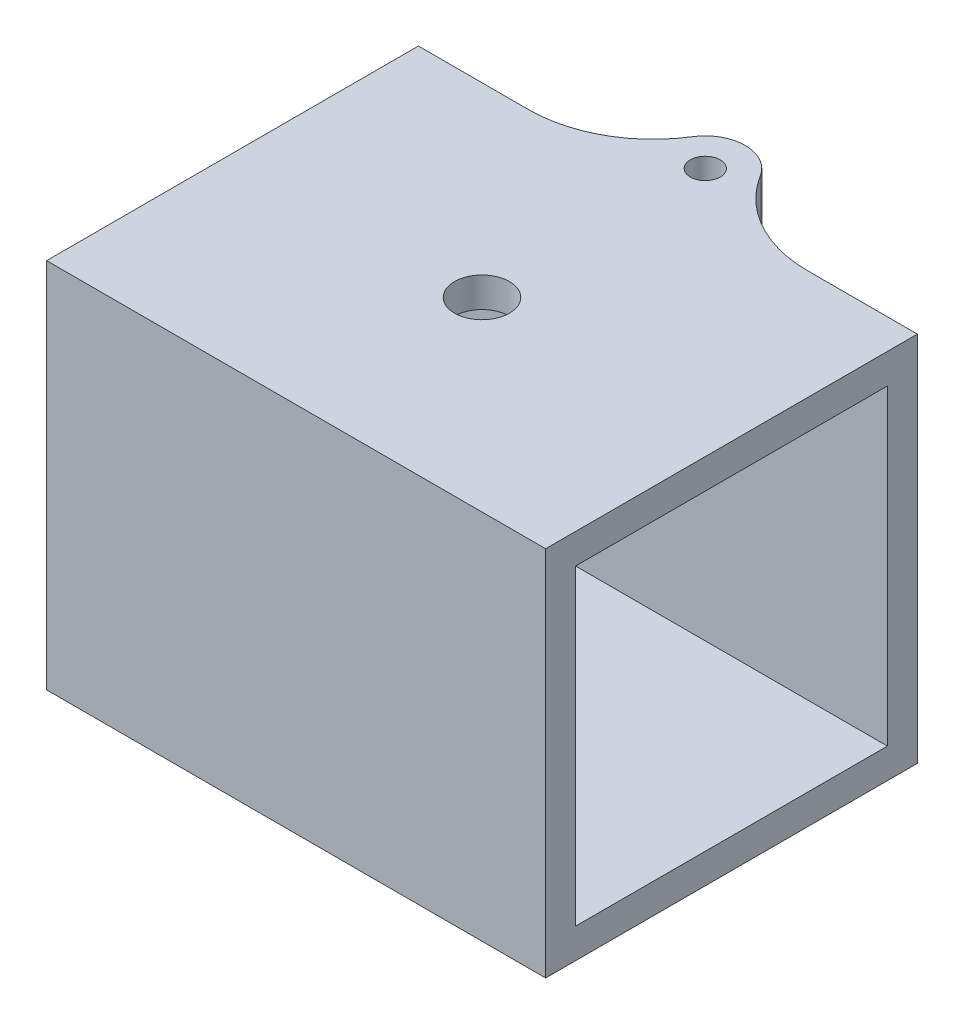
ISO-10303-21;
HEADER;
FILE_DESCRIPTION(('STEP AP214'),'2;1');
FILE_NAME('part.step','',(''),(''),'','','');
FILE_SCHEMA(('AUTOMOTIVE_DESIGN { 1 0 10303 214 1 1 1 1 }'));
ENDSEC;
DATA;
#1=APPLICATION_CONTEXT('core data for automotive mechanical design processes');
#2=APPLICATION_PROTOCOL_DEFINITION('international standard','automotive_design',2000,#1);
#3=PRODUCT_CONTEXT('',#1,'mechanical');
#4=PRODUCT('Part','Part','',(#3));
#5=PRODUCT_RELATED_PRODUCT_CATEGORY('part','',(#4));
#6=PRODUCT_DEFINITION_FORMATION('','',#4);
#7=PRODUCT_DEFINITION_CONTEXT('part definition',#1,'design');
#8=PRODUCT_DEFINITION('design','',#6,#7);
#9=PRODUCT_DEFINITION_SHAPE('','',#8);
#10=(LENGTH_UNIT() NAMED_UNIT(*) SI_UNIT(.MILLI.,.METRE.));
#11=(NAMED_UNIT(*) PLANE_ANGLE_UNIT() SI_UNIT($,.RADIAN.));
#12=(NAMED_UNIT(*) SI_UNIT($,.STERADIAN.) SOLID_ANGLE_UNIT());
#13=UNCERTAINTY_MEASURE_WITH_UNIT(LENGTH_MEASURE(1.E-05),#10,'distance_accuracy_value','');
#14=(GEOMETRIC_REPRESENTATION_CONTEXT(3) GLOBAL_UNCERTAINTY_ASSIGNED_CONTEXT((#13)) GLOBAL_UNIT_ASSIGNED_CONTEXT((#10,
#11,#12)) REPRESENTATION_CONTEXT('',''));
#15=CARTESIAN_POINT('',(0.,0.,0.));
#16=DIRECTION('',(0.,0.,1.));
#17=DIRECTION('',(1.,0.,0.));
#18=AXIS2_PLACEMENT_3D('',#15,#16,#17);
#19=CARTESIAN_POINT('',(40.,0.,0.));
#20=DIRECTION('',(1.,0.,0.));
#21=DIRECTION('',(0.,0.,-1.));
#22=AXIS2_PLACEMENT_3D('',#19,#20,#21);
#23=PLANE('',#22);
#24=DIRECTION('',(0.,1.,0.));
#25=VECTOR('',#24,1.);
#26=CARTESIAN_POINT('',(40.,0.,-14.9));
#27=LINE('',#26,#25);
#28=CARTESIAN_POINT('',(40.,-14.9,-14.9));
#29=VERTEX_POINT('',#28);
#30=CARTESIAN_POINT('',(40.,14.9,-14.9));
#31=VERTEX_POINT('',#30);
#32=EDGE_CURVE('E214',#29,#31,#27,.T.);
#33=ORIENTED_EDGE('',*,*,#32,.T.);
#34=DIRECTION('',(0.,0.,1.));
#35=VECTOR('',#34,1.);
#36=CARTESIAN_POINT('',(40.,14.9,0.));
#37=LINE('',#36,#35);
#38=CARTESIAN_POINT('',(40.,14.9,14.9));
#39=VERTEX_POINT('',#38);
#40=EDGE_CURVE('E217',#31,#39,#37,.T.);
#41=ORIENTED_EDGE('',*,*,#40,.T.);
#42=DIRECTION('',(0.,-1.,0.));
#43=VECTOR('',#42,1.);
#44=CARTESIAN_POINT('',(40.,0.,14.9));
#45=LINE('',#44,#43);
#46=CARTESIAN_POINT('',(40.,-14.9,14.9));
#47=VERTEX_POINT('',#46);
#48=EDGE_CURVE('E220',#39,#47,#45,.T.);
#49=ORIENTED_EDGE('',*,*,#48,.T.);
#50=DIRECTION('',(0.,0.,-1.));
#51=VECTOR('',#50,1.);
#52=CARTESIAN_POINT('',(40.,-14.9,0.));
#53=LINE('',#52,#51);
#54=EDGE_CURVE('E222',#47,#29,#53,.T.);
#55=ORIENTED_EDGE('',*,*,#54,.T.);
#56=EDGE_LOOP('',(#33,#41,#49,#55));
#57=FACE_BOUND('',#56,.T.);
#58=DIRECTION('',(0.,0.,1.));
#59=VECTOR('',#58,1.);
#60=CARTESIAN_POINT('',(40.,12.5,12.5));
#61=LINE('',#60,#59);
#62=CARTESIAN_POINT('',(40.,12.5,-12.5));
#63=VERTEX_POINT('',#62);
#64=CARTESIAN_POINT('',(40.,12.5,12.5));
#65=VERTEX_POINT('',#64);
#66=EDGE_CURVE('E181',#63,#65,#61,.T.);
#67=ORIENTED_EDGE('',*,*,#66,.F.);
#68=DIRECTION('',(0.,1.,0.));
#69=VECTOR('',#68,1.);
#70=CARTESIAN_POINT('',(40.,-12.5,-12.5));
#71=LINE('',#70,#69);
#72=CARTESIAN_POINT('',(40.,-12.5,-12.5));
#73=VERTEX_POINT('',#72);
#74=EDGE_CURVE('E171',#73,#63,#71,.T.);
#75=ORIENTED_EDGE('',*,*,#74,.F.);
#76=DIRECTION('',(0.,0.,-1.));
#77=VECTOR('',#76,1.);
#78=CARTESIAN_POINT('',(40.,-12.5,12.5));
#79=LINE('',#78,#77);
#80=CARTESIAN_POINT('',(40.,-12.5,12.5));
#81=VERTEX_POINT('',#80);
#82=EDGE_CURVE('E196',#81,#73,#79,.T.);
#83=ORIENTED_EDGE('',*,*,#82,.F.);
#84=DIRECTION('',(0.,-1.,0.));
#85=VECTOR('',#84,1.);
#86=CARTESIAN_POINT('',(40.,-12.5,12.5));
#87=LINE('',#86,#85);
#88=EDGE_CURVE('E194',#65,#81,#87,.T.);
#89=ORIENTED_EDGE('',*,*,#88,.F.);
#90=EDGE_LOOP('',(#67,#75,#83,#89));
#91=FACE_BOUND('',#90,.T.);
#92=ADVANCED_FACE('F57',(#57,#91),#23,.T.);
#93=CARTESIAN_POINT('',(0.,0.,0.));
#94=DIRECTION('',(1.,0.,0.));
#95=DIRECTION('',(0.,0.,-1.));
#96=AXIS2_PLACEMENT_3D('',#93,#94,#95);
#97=PLANE('',#96);
#98=DIRECTION('',(0.,1.,0.));
#99=VECTOR('',#98,1.);
#100=CARTESIAN_POINT('',(0.,0.,-14.9));
#101=LINE('',#100,#99);
#102=CARTESIAN_POINT('',(0.,-14.9,-14.9));
#103=VERTEX_POINT('',#102);
#104=CARTESIAN_POINT('',(0.,14.9,-14.9));
#105=VERTEX_POINT('',#104);
#106=EDGE_CURVE('E189',#103,#105,#101,.T.);
#107=ORIENTED_EDGE('',*,*,#106,.F.);
#108=DIRECTION('',(0.,0.,-1.));
#109=VECTOR('',#108,1.);
#110=CARTESIAN_POINT('',(0.,-14.9,0.));
#111=LINE('',#110,#109);
#112=CARTESIAN_POINT('',(0.,-14.9,14.9));
#113=VERTEX_POINT('',#112);
#114=EDGE_CURVE('E218',#113,#103,#111,.T.);
#115=ORIENTED_EDGE('',*,*,#114,.F.);
#116=DIRECTION('',(0.,-1.,0.));
#117=VECTOR('',#116,1.);
#118=CARTESIAN_POINT('',(0.,0.,14.9));
#119=LINE('',#118,#117);
#120=CARTESIAN_POINT('',(0.,14.9,14.9));
#121=VERTEX_POINT('',#120);
#122=EDGE_CURVE('E229',#121,#113,#119,.T.);
#123=ORIENTED_EDGE('',*,*,#122,.F.);
#124=DIRECTION('',(0.,0.,1.));
#125=VECTOR('',#124,1.);
#126=CARTESIAN_POINT('',(0.,14.9,0.));
#127=LINE('',#126,#125);
#128=EDGE_CURVE('E227',#105,#121,#127,.T.);
#129=ORIENTED_EDGE('',*,*,#128,.F.);
#130=EDGE_LOOP('',(#107,#115,#123,#129));
#131=FACE_BOUND('',#130,.T.);
#132=DIRECTION('',(0.,1.,0.));
#133=VECTOR('',#132,1.);
#134=CARTESIAN_POINT('',(0.,-12.5,-12.5));
#135=LINE('',#134,#133);
#136=CARTESIAN_POINT('',(0.,-12.5,-12.5));
#137=VERTEX_POINT('',#136);
#138=CARTESIAN_POINT('',(0.,12.5,-12.5));
#139=VERTEX_POINT('',#138);
#140=EDGE_CURVE('E201',#137,#139,#135,.T.);
#141=ORIENTED_EDGE('',*,*,#140,.T.);
#142=DIRECTION('',(0.,0.,1.));
#143=VECTOR('',#142,1.);
#144=CARTESIAN_POINT('',(0.,12.5,12.5));
#145=LINE('',#144,#143);
#146=CARTESIAN_POINT('',(0.,12.5,12.5));
#147=VERTEX_POINT('',#146);
#148=EDGE_CURVE('E188',#139,#147,#145,.T.);
#149=ORIENTED_EDGE('',*,*,#148,.T.);
#150=DIRECTION('',(0.,-1.,0.));
#151=VECTOR('',#150,1.);
#152=CARTESIAN_POINT('',(0.,-12.5,12.5));
#153=LINE('',#152,#151);
#154=CARTESIAN_POINT('',(0.,-12.5,12.5));
#155=VERTEX_POINT('',#154);
#156=EDGE_CURVE('E205',#147,#155,#153,.T.);
#157=ORIENTED_EDGE('',*,*,#156,.T.);
#158=DIRECTION('',(0.,0.,-1.));
#159=VECTOR('',#158,1.);
#160=CARTESIAN_POINT('',(0.,-12.5,12.5));
#161=LINE('',#160,#159);
#162=EDGE_CURVE('E182',#155,#137,#161,.T.);
#163=ORIENTED_EDGE('',*,*,#162,.T.);
#164=EDGE_LOOP('',(#141,#149,#157,#163));
#165=FACE_BOUND('',#164,.T.);
#166=ADVANCED_FACE('F355',(#131,#165),#97,.F.);
#167=CARTESIAN_POINT('',(40.,0.,-14.9));
#168=DIRECTION('',(0.,0.,1.));
#169=DIRECTION('',(1.,0.,0.));
#170=AXIS2_PLACEMENT_3D('',#167,#168,#169);
#171=PLANE('',#170);
#172=DIRECTION('',(-1.,0.,0.));
#173=VECTOR('',#172,1.);
#174=CARTESIAN_POINT('',(40.,14.9,-14.9));
#175=LINE('',#174,#173);
#176=CARTESIAN_POINT('',(8.80893213316978,14.9,-14.9));
#177=VERTEX_POINT('',#176);
#178=EDGE_CURVE('E242',#177,#105,#175,.T.);
#179=ORIENTED_EDGE('',*,*,#178,.F.);
#180=DIRECTION('',(0.,1.,0.));
#181=VECTOR('',#180,1.);
#182=CARTESIAN_POINT('',(8.80893213316978,0.,-14.9));
#183=LINE('',#182,#181);
#184=CARTESIAN_POINT('',(8.80893213316978,10.9,-14.9));
#185=VERTEX_POINT('',#184);
#186=EDGE_CURVE('E259',#177,#185,#183,.F.);
#187=ORIENTED_EDGE('',*,*,#186,.T.);
#188=DIRECTION('',(-1.,0.,0.));
#189=VECTOR('',#188,1.);
#190=CARTESIAN_POINT('',(40.,10.9,-14.9));
#191=LINE('',#190,#189);
#192=CARTESIAN_POINT('',(31.1910678668302,10.9,-14.9));
#193=VERTEX_POINT('',#192);
#194=EDGE_CURVE('E248',#193,#185,#191,.T.);
#195=ORIENTED_EDGE('',*,*,#194,.F.);
#196=DIRECTION('',(0.,1.,0.));
#197=VECTOR('',#196,1.);
#198=CARTESIAN_POINT('',(31.1910678668302,0.,-14.9));
#199=LINE('',#198,#197);
#200=CARTESIAN_POINT('',(31.1910678668302,14.9,-14.9));
#201=VERTEX_POINT('',#200);
#202=EDGE_CURVE('E256',#193,#201,#199,.T.);
#203=ORIENTED_EDGE('',*,*,#202,.T.);
#204=EDGE_CURVE('E243',#31,#201,#175,.T.);
#205=ORIENTED_EDGE('',*,*,#204,.F.);
#206=ORIENTED_EDGE('',*,*,#32,.F.);
#207=DIRECTION('',(-1.,0.,0.));
#208=VECTOR('',#207,1.);
#209=CARTESIAN_POINT('',(40.,-14.9,-14.9));
#210=LINE('',#209,#208);
#211=CARTESIAN_POINT('',(31.1910678668302,-14.9,-14.9));
#212=VERTEX_POINT('',#211);
#213=EDGE_CURVE('E233',#29,#212,#210,.T.);
#214=ORIENTED_EDGE('',*,*,#213,.T.);
#215=DIRECTION('',(0.,-1.,0.));
#216=VECTOR('',#215,1.);
#217=CARTESIAN_POINT('',(31.1910678668302,0.,-14.9));
#218=LINE('',#217,#216);
#219=CARTESIAN_POINT('',(31.1910678668302,-10.9,-14.9));
#220=VERTEX_POINT('',#219);
#221=EDGE_CURVE('E253',#212,#220,#218,.F.);
#222=ORIENTED_EDGE('',*,*,#221,.T.);
#223=DIRECTION('',(1.,0.,0.));
#224=VECTOR('',#223,1.);
#225=CARTESIAN_POINT('',(40.,-10.9,-14.9));
#226=LINE('',#225,#224);
#227=CARTESIAN_POINT('',(8.80893213316978,-10.9,-14.9));
#228=VERTEX_POINT('',#227);
#229=EDGE_CURVE('E246',#228,#220,#226,.T.);
#230=ORIENTED_EDGE('',*,*,#229,.F.);
#231=DIRECTION('',(0.,-1.,0.));
#232=VECTOR('',#231,1.);
#233=CARTESIAN_POINT('',(8.80893213316978,0.,-14.9));
#234=LINE('',#233,#232);
#235=CARTESIAN_POINT('',(8.80893213316978,-14.9,-14.9));
#236=VERTEX_POINT('',#235);
#237=EDGE_CURVE('E250',#228,#236,#234,.T.);
#238=ORIENTED_EDGE('',*,*,#237,.T.);
#239=EDGE_CURVE('E224',#236,#103,#210,.T.);
#240=ORIENTED_EDGE('',*,*,#239,.T.);
#241=ORIENTED_EDGE('',*,*,#106,.T.);
#242=EDGE_LOOP('',(#179,#187,#195,#203,#205,#206,#214,#222,#230,#238,#240,#241));
#243=FACE_BOUND('',#242,.T.);
#244=ADVANCED_FACE('F292',(#243),#171,.F.);
#245=CARTESIAN_POINT('',(40.,14.9,0.));
#246=DIRECTION('',(0.,-1.,0.));
#247=DIRECTION('',(0.,0.,-1.));
#248=AXIS2_PLACEMENT_3D('',#245,#246,#247);
#249=PLANE('',#248);
#250=CARTESIAN_POINT('',(20.,14.9,0.));
#251=DIRECTION('',(0.,1.,0.));
#252=DIRECTION('',(0.,0.,1.));
#253=AXIS2_PLACEMENT_3D('',#250,#251,#252);
#254=CIRCLE('',#253,2.2);
#255=CARTESIAN_POINT('',(20.,14.9,2.2));
#256=VERTEX_POINT('',#255);
#257=EDGE_CURVE('E203',#256,#256,#254,.T.);
#258=ORIENTED_EDGE('',*,*,#257,.F.);
#259=EDGE_LOOP('',(#258));
#260=FACE_BOUND('',#259,.T.);
#261=ORIENTED_EDGE('',*,*,#204,.T.);
#262=CARTESIAN_POINT('',(31.1910678668302,14.9,-24.9));
#263=DIRECTION('',(0.,-1.,0.));
#264=DIRECTION('',(0.,0.,-1.));
#265=AXIS2_PLACEMENT_3D('',#262,#263,#264);
#266=CIRCLE('',#265,10.);
#267=CARTESIAN_POINT('',(22.7129861495346,14.9,-19.5969696969697));
#268=VERTEX_POINT('',#267);
#269=EDGE_CURVE('E273',#201,#268,#266,.T.);
#270=ORIENTED_EDGE('',*,*,#269,.T.);
#271=CARTESIAN_POINT('',(20.,14.9,-17.9));
#272=DIRECTION('',(0.,1.,0.));
#273=DIRECTION('',(0.,0.,1.));
#274=AXIS2_PLACEMENT_3D('',#271,#272,#273);
#275=CIRCLE('',#274,3.2);
#276=CARTESIAN_POINT('',(17.2870138504654,14.9,-19.5969696969697));
#277=VERTEX_POINT('',#276);
#278=EDGE_CURVE('E330',#268,#277,#275,.T.);
#279=ORIENTED_EDGE('',*,*,#278,.T.);
#280=CARTESIAN_POINT('',(8.80893213316978,14.9,-24.9));
#281=DIRECTION('',(0.,-1.,0.));
#282=DIRECTION('',(0.,0.,-1.));
#283=AXIS2_PLACEMENT_3D('',#280,#281,#282);
#284=CIRCLE('',#283,10.);
#285=EDGE_CURVE('E271',#277,#177,#284,.T.);
#286=ORIENTED_EDGE('',*,*,#285,.T.);
#287=ORIENTED_EDGE('',*,*,#178,.T.);
#288=ORIENTED_EDGE('',*,*,#128,.T.);
#289=DIRECTION('',(-1.,0.,0.));
#290=VECTOR('',#289,1.);
#291=CARTESIAN_POINT('',(40.,14.9,14.9));
#292=LINE('',#291,#290);
#293=EDGE_CURVE('E239',#39,#121,#292,.T.);
#294=ORIENTED_EDGE('',*,*,#293,.F.);
#295=ORIENTED_EDGE('',*,*,#40,.F.);
#296=EDGE_LOOP('',(#261,#270,#279,#286,#287,#288,#294,#295));
#297=FACE_BOUND('',#296,.T.);
#298=CARTESIAN_POINT('',(20.,14.9,-17.9));
#299=DIRECTION('',(0.,1.,0.));
#300=DIRECTION('',(0.,0.,1.));
#301=AXIS2_PLACEMENT_3D('',#298,#299,#300);
#302=CIRCLE('',#301,1.2);
#303=CARTESIAN_POINT('',(20.,14.9,-16.7));
#304=VERTEX_POINT('',#303);
#305=EDGE_CURVE('E325',#304,#304,#302,.T.);
#306=ORIENTED_EDGE('',*,*,#305,.F.);
#307=EDGE_LOOP('',(#306));
#308=FACE_BOUND('',#307,.T.);
#309=ADVANCED_FACE('F317',(#260,#297,#308),#249,.F.);
#310=CARTESIAN_POINT('',(40.,0.,14.9));
#311=DIRECTION('',(0.,0.,-1.));
#312=DIRECTION('',(-1.,0.,0.));
#313=AXIS2_PLACEMENT_3D('',#310,#311,#312);
#314=PLANE('',#313);
#315=ORIENTED_EDGE('',*,*,#122,.T.);
#316=DIRECTION('',(-1.,0.,0.));
#317=VECTOR('',#316,1.);
#318=CARTESIAN_POINT('',(40.,-14.9,14.9));
#319=LINE('',#318,#317);
#320=EDGE_CURVE('E236',#47,#113,#319,.T.);
#321=ORIENTED_EDGE('',*,*,#320,.F.);
#322=ORIENTED_EDGE('',*,*,#48,.F.);
#323=ORIENTED_EDGE('',*,*,#293,.T.);
#324=EDGE_LOOP('',(#315,#321,#322,#323));
#325=FACE_BOUND('',#324,.T.);
#326=ADVANCED_FACE('F320',(#325),#314,.F.);
#327=CARTESIAN_POINT('',(40.,-14.9,0.));
#328=DIRECTION('',(0.,1.,0.));
#329=DIRECTION('',(0.,0.,1.));
#330=AXIS2_PLACEMENT_3D('',#327,#328,#329);
#331=PLANE('',#330);
#332=ORIENTED_EDGE('',*,*,#239,.F.);
#333=CARTESIAN_POINT('',(8.80893213316978,-14.9,-24.9));
#334=DIRECTION('',(0.,1.,0.));
#335=DIRECTION('',(0.,0.,1.));
#336=AXIS2_PLACEMENT_3D('',#333,#334,#335);
#337=CIRCLE('',#336,10.);
#338=CARTESIAN_POINT('',(17.2870138504654,-14.9,-19.5969696969697));
#339=VERTEX_POINT('',#338);
#340=EDGE_CURVE('E65',#236,#339,#337,.T.);
#341=ORIENTED_EDGE('',*,*,#340,.T.);
#342=CARTESIAN_POINT('',(20.,-14.9,-17.9));
#343=DIRECTION('',(0.,-1.,0.));
#344=DIRECTION('',(0.,0.,-1.));
#345=AXIS2_PLACEMENT_3D('',#342,#343,#344);
#346=CIRCLE('',#345,3.2);
#347=CARTESIAN_POINT('',(22.7129861495346,-14.9,-19.5969696969697));
#348=VERTEX_POINT('',#347);
#349=EDGE_CURVE('E287',#339,#348,#346,.T.);
#350=ORIENTED_EDGE('',*,*,#349,.T.);
#351=CARTESIAN_POINT('',(31.1910678668302,-14.9,-24.9));
#352=DIRECTION('',(0.,1.,0.));
#353=DIRECTION('',(0.,0.,1.));
#354=AXIS2_PLACEMENT_3D('',#351,#352,#353);
#355=CIRCLE('',#354,10.);
#356=EDGE_CURVE('E280',#348,#212,#355,.T.);
#357=ORIENTED_EDGE('',*,*,#356,.T.);
#358=ORIENTED_EDGE('',*,*,#213,.F.);
#359=ORIENTED_EDGE('',*,*,#54,.F.);
#360=ORIENTED_EDGE('',*,*,#320,.T.);
#361=ORIENTED_EDGE('',*,*,#114,.T.);
#362=EDGE_LOOP('',(#332,#341,#350,#357,#358,#359,#360,#361));
#363=FACE_BOUND('',#362,.T.);
#364=CARTESIAN_POINT('',(20.,-14.9,-17.9));
#365=DIRECTION('',(0.,-1.,0.));
#366=DIRECTION('',(0.,0.,-1.));
#367=AXIS2_PLACEMENT_3D('',#364,#365,#366);
#368=CIRCLE('',#367,1.2);
#369=CARTESIAN_POINT('',(20.,-14.9,-19.1));
#370=VERTEX_POINT('',#369);
#371=EDGE_CURVE('E310',#370,#370,#368,.T.);
#372=ORIENTED_EDGE('',*,*,#371,.F.);
#373=EDGE_LOOP('',(#372));
#374=FACE_BOUND('',#373,.T.);
#375=ADVANCED_FACE('F283',(#363,#374),#331,.F.);
#376=CARTESIAN_POINT('',(40.,-12.5,-12.5));
#377=DIRECTION('',(0.,0.,1.));
#378=DIRECTION('',(1.,0.,0.));
#379=AXIS2_PLACEMENT_3D('',#376,#377,#378);
#380=PLANE('',#379);
#381=ORIENTED_EDGE('',*,*,#140,.F.);
#382=DIRECTION('',(-1.,0.,0.));
#383=VECTOR('',#382,1.);
#384=CARTESIAN_POINT('',(40.,-12.5,-12.5));
#385=LINE('',#384,#383);
#386=EDGE_CURVE('E177',#73,#137,#385,.T.);
#387=ORIENTED_EDGE('',*,*,#386,.F.);
#388=ORIENTED_EDGE('',*,*,#74,.T.);
#389=DIRECTION('',(-1.,0.,0.));
#390=VECTOR('',#389,1.);
#391=CARTESIAN_POINT('',(40.,12.5,-12.5));
#392=LINE('',#391,#390);
#393=EDGE_CURVE('E174',#63,#139,#392,.T.);
#394=ORIENTED_EDGE('',*,*,#393,.T.);
#395=EDGE_LOOP('',(#381,#387,#388,#394));
#396=FACE_BOUND('',#395,.T.);
#397=ADVANCED_FACE('F173',(#396),#380,.T.);
#398=CARTESIAN_POINT('',(40.,12.5,12.5));
#399=DIRECTION('',(0.,-1.,0.));
#400=DIRECTION('',(0.,0.,-1.));
#401=AXIS2_PLACEMENT_3D('',#398,#399,#400);
#402=PLANE('',#401);
#403=CARTESIAN_POINT('',(20.,12.5,0.));
#404=DIRECTION('',(0.,-1.,0.));
#405=DIRECTION('',(0.,0.,-1.));
#406=AXIS2_PLACEMENT_3D('',#403,#404,#405);
#407=CIRCLE('',#406,2.2);
#408=CARTESIAN_POINT('',(20.,12.5,-2.2));
#409=VERTEX_POINT('',#408);
#410=EDGE_CURVE('E303',#409,#409,#407,.F.);
#411=ORIENTED_EDGE('',*,*,#410,.T.);
#412=EDGE_LOOP('',(#411));
#413=FACE_BOUND('',#412,.T.);
#414=ORIENTED_EDGE('',*,*,#148,.F.);
#415=ORIENTED_EDGE('',*,*,#393,.F.);
#416=ORIENTED_EDGE('',*,*,#66,.T.);
#417=DIRECTION('',(-1.,0.,0.));
#418=VECTOR('',#417,1.);
#419=CARTESIAN_POINT('',(40.,12.5,12.5));
#420=LINE('',#419,#418);
#421=EDGE_CURVE('E190',#65,#147,#420,.T.);
#422=ORIENTED_EDGE('',*,*,#421,.T.);
#423=EDGE_LOOP('',(#414,#415,#416,#422));
#424=FACE_BOUND('',#423,.T.);
#425=ADVANCED_FACE('F185',(#413,#424),#402,.T.);
#426=CARTESIAN_POINT('',(40.,-12.5,12.5));
#427=DIRECTION('',(0.,0.,-1.));
#428=DIRECTION('',(-1.,0.,0.));
#429=AXIS2_PLACEMENT_3D('',#426,#427,#428);
#430=PLANE('',#429);
#431=ORIENTED_EDGE('',*,*,#156,.F.);
#432=ORIENTED_EDGE('',*,*,#421,.F.);
#433=ORIENTED_EDGE('',*,*,#88,.T.);
#434=DIRECTION('',(-1.,0.,0.));
#435=VECTOR('',#434,1.);
#436=CARTESIAN_POINT('',(40.,-12.5,12.5));
#437=LINE('',#436,#435);
#438=EDGE_CURVE('E211',#81,#155,#437,.T.);
#439=ORIENTED_EDGE('',*,*,#438,.T.);
#440=EDGE_LOOP('',(#431,#432,#433,#439));
#441=FACE_BOUND('',#440,.T.);
#442=ADVANCED_FACE('F365',(#441),#430,.T.);
#443=CARTESIAN_POINT('',(40.,-12.5,12.5));
#444=DIRECTION('',(0.,1.,0.));
#445=DIRECTION('',(0.,0.,1.));
#446=AXIS2_PLACEMENT_3D('',#443,#444,#445);
#447=PLANE('',#446);
#448=ORIENTED_EDGE('',*,*,#162,.F.);
#449=ORIENTED_EDGE('',*,*,#438,.F.);
#450=ORIENTED_EDGE('',*,*,#82,.T.);
#451=ORIENTED_EDGE('',*,*,#386,.T.);
#452=EDGE_LOOP('',(#448,#449,#450,#451));
#453=FACE_BOUND('',#452,.T.);
#454=ADVANCED_FACE('F369',(#453),#447,.T.);
#455=CARTESIAN_POINT('',(20.,-14.901,0.));
#456=DIRECTION('',(0.,1.,0.));
#457=DIRECTION('',(0.,0.,1.));
#458=AXIS2_PLACEMENT_3D('',#455,#456,#457);
#459=CYLINDRICAL_SURFACE('',#458,2.2);
#460=ORIENTED_EDGE('',*,*,#410,.F.);
#461=EDGE_LOOP('',(#460));
#462=FACE_BOUND('',#461,.T.);
#463=ORIENTED_EDGE('',*,*,#257,.T.);
#464=EDGE_LOOP('',(#463));
#465=FACE_BOUND('',#464,.T.);
#466=ADVANCED_FACE('F315',(#462,#465),#459,.F.);
#467=CARTESIAN_POINT('',(20.,-10.9,-17.9));
#468=DIRECTION('',(0.,-1.,0.));
#469=DIRECTION('',(0.,0.,-1.));
#470=AXIS2_PLACEMENT_3D('',#467,#468,#469);
#471=PLANE('',#470);
#472=CARTESIAN_POINT('',(20.,-10.9,-17.9));
#473=DIRECTION('',(0.,-1.,0.));
#474=DIRECTION('',(0.,0.,-1.));
#475=AXIS2_PLACEMENT_3D('',#472,#473,#474);
#476=CIRCLE('',#475,1.2);
#477=CARTESIAN_POINT('',(20.,-10.9,-19.1));
#478=VERTEX_POINT('',#477);
#479=EDGE_CURVE('E307',#478,#478,#476,.T.);
#480=ORIENTED_EDGE('',*,*,#479,.T.);
#481=EDGE_LOOP('',(#480));
#482=FACE_BOUND('',#481,.T.);
#483=CARTESIAN_POINT('',(20.,-10.9,-17.9));
#484=DIRECTION('',(0.,-1.,0.));
#485=DIRECTION('',(0.,0.,-1.));
#486=AXIS2_PLACEMENT_3D('',#483,#484,#485);
#487=CIRCLE('',#486,3.2);
#488=CARTESIAN_POINT('',(17.2870138504654,-10.9,-19.5969696969697));
#489=VERTEX_POINT('',#488);
#490=CARTESIAN_POINT('',(22.7129861495346,-10.9,-19.5969696969697));
#491=VERTEX_POINT('',#490);
#492=EDGE_CURVE('E299',#489,#491,#487,.T.);
#493=ORIENTED_EDGE('',*,*,#492,.F.);
#494=CARTESIAN_POINT('',(8.80893213316978,-10.9,-24.9));
#495=DIRECTION('',(0.,-1.,0.));
#496=DIRECTION('',(0.,0.,-1.));
#497=AXIS2_PLACEMENT_3D('',#494,#495,#496);
#498=CIRCLE('',#497,10.);
#499=EDGE_CURVE('E12',#489,#228,#498,.T.);
#500=ORIENTED_EDGE('',*,*,#499,.T.);
#501=ORIENTED_EDGE('',*,*,#229,.T.);
#502=CARTESIAN_POINT('',(31.1910678668302,-10.9,-24.9));
#503=DIRECTION('',(0.,-1.,0.));
#504=DIRECTION('',(0.,0.,-1.));
#505=AXIS2_PLACEMENT_3D('',#502,#503,#504);
#506=CIRCLE('',#505,10.);
#507=EDGE_CURVE('E278',#220,#491,#506,.T.);
#508=ORIENTED_EDGE('',*,*,#507,.T.);
#509=EDGE_LOOP('',(#493,#500,#501,#508));
#510=FACE_BOUND('',#509,.T.);
#511=ADVANCED_FACE('F298',(#482,#510),#471,.F.);
#512=CARTESIAN_POINT('',(20.,-10.9,-17.9));
#513=DIRECTION('',(0.,-1.,0.));
#514=DIRECTION('',(0.,0.,-1.));
#515=AXIS2_PLACEMENT_3D('',#512,#513,#514);
#516=CYLINDRICAL_SURFACE('',#515,3.2);
#517=ORIENTED_EDGE('',*,*,#492,.T.);
#518=DIRECTION('',(0.,-1.,0.));
#519=VECTOR('',#518,1.);
#520=CARTESIAN_POINT('',(22.7129861495346,-10.9,-19.5969696969697));
#521=LINE('',#520,#519);
#522=EDGE_CURVE('E72',#491,#348,#521,.T.);
#523=ORIENTED_EDGE('',*,*,#522,.T.);
#524=ORIENTED_EDGE('',*,*,#349,.F.);
#525=DIRECTION('',(0.,-1.,0.));
#526=VECTOR('',#525,1.);
#527=CARTESIAN_POINT('',(17.2870138504654,-10.9,-19.5969696969697));
#528=LINE('',#527,#526);
#529=EDGE_CURVE('E266',#339,#489,#528,.F.);
#530=ORIENTED_EDGE('',*,*,#529,.T.);
#531=EDGE_LOOP('',(#517,#523,#524,#530));
#532=FACE_BOUND('',#531,.T.);
#533=ADVANCED_FACE('F301',(#532),#516,.T.);
#534=CARTESIAN_POINT('',(20.,-10.9,-17.9));
#535=DIRECTION('',(0.,-1.,0.));
#536=DIRECTION('',(0.,0.,-1.));
#537=AXIS2_PLACEMENT_3D('',#534,#535,#536);
#538=CYLINDRICAL_SURFACE('',#537,1.2);
#539=ORIENTED_EDGE('',*,*,#479,.F.);
#540=EDGE_LOOP('',(#539));
#541=FACE_BOUND('',#540,.T.);
#542=ORIENTED_EDGE('',*,*,#371,.T.);
#543=EDGE_LOOP('',(#542));
#544=FACE_BOUND('',#543,.T.);
#545=ADVANCED_FACE('F343',(#541,#544),#538,.F.);
#546=CARTESIAN_POINT('',(20.,10.9,-17.9));
#547=DIRECTION('',(0.,1.,0.));
#548=DIRECTION('',(0.,0.,1.));
#549=AXIS2_PLACEMENT_3D('',#546,#547,#548);
#550=PLANE('',#549);
#551=CARTESIAN_POINT('',(20.,10.9,-17.9));
#552=DIRECTION('',(0.,1.,0.));
#553=DIRECTION('',(0.,0.,1.));
#554=AXIS2_PLACEMENT_3D('',#551,#552,#553);
#555=CIRCLE('',#554,1.2);
#556=CARTESIAN_POINT('',(20.,10.9,-16.7));
#557=VERTEX_POINT('',#556);
#558=EDGE_CURVE('E327',#557,#557,#555,.T.);
#559=ORIENTED_EDGE('',*,*,#558,.T.);
#560=EDGE_LOOP('',(#559));
#561=FACE_BOUND('',#560,.T.);
#562=CARTESIAN_POINT('',(20.,10.9,-17.9));
#563=DIRECTION('',(0.,1.,0.));
#564=DIRECTION('',(0.,0.,1.));
#565=AXIS2_PLACEMENT_3D('',#562,#563,#564);
#566=CIRCLE('',#565,3.2);
#567=CARTESIAN_POINT('',(22.7129861495346,10.9,-19.5969696969697));
#568=VERTEX_POINT('',#567);
#569=CARTESIAN_POINT('',(17.2870138504654,10.9,-19.5969696969697));
#570=VERTEX_POINT('',#569);
#571=EDGE_CURVE('E333',#568,#570,#566,.T.);
#572=ORIENTED_EDGE('',*,*,#571,.F.);
#573=CARTESIAN_POINT('',(31.1910678668302,10.9,-24.9));
#574=DIRECTION('',(0.,1.,0.));
#575=DIRECTION('',(0.,0.,1.));
#576=AXIS2_PLACEMENT_3D('',#573,#574,#575);
#577=CIRCLE('',#576,10.);
#578=EDGE_CURVE('E275',#568,#193,#577,.T.);
#579=ORIENTED_EDGE('',*,*,#578,.T.);
#580=ORIENTED_EDGE('',*,*,#194,.T.);
#581=CARTESIAN_POINT('',(8.80893213316978,10.9,-24.9));
#582=DIRECTION('',(0.,1.,0.));
#583=DIRECTION('',(0.,0.,1.));
#584=AXIS2_PLACEMENT_3D('',#581,#582,#583);
#585=CIRCLE('',#584,10.);
#586=EDGE_CURVE('E269',#185,#570,#585,.T.);
#587=ORIENTED_EDGE('',*,*,#586,.T.);
#588=EDGE_LOOP('',(#572,#579,#580,#587));
#589=FACE_BOUND('',#588,.T.);
#590=ADVANCED_FACE('F383',(#561,#589),#550,.F.);
#591=CARTESIAN_POINT('',(20.,10.9,-17.9));
#592=DIRECTION('',(0.,1.,0.));
#593=DIRECTION('',(0.,0.,1.));
#594=AXIS2_PLACEMENT_3D('',#591,#592,#593);
#595=CYLINDRICAL_SURFACE('',#594,3.2);
#596=ORIENTED_EDGE('',*,*,#571,.T.);
#597=DIRECTION('',(0.,1.,0.));
#598=VECTOR('',#597,1.);
#599=CARTESIAN_POINT('',(17.2870138504654,10.9,-19.5969696969697));
#600=LINE('',#599,#598);
#601=EDGE_CURVE('E264',#570,#277,#600,.T.);
#602=ORIENTED_EDGE('',*,*,#601,.T.);
#603=ORIENTED_EDGE('',*,*,#278,.F.);
#604=DIRECTION('',(0.,1.,0.));
#605=VECTOR('',#604,1.);
#606=CARTESIAN_POINT('',(22.7129861495346,10.9,-19.5969696969697));
#607=LINE('',#606,#605);
#608=EDGE_CURVE('E262',#268,#568,#607,.F.);
#609=ORIENTED_EDGE('',*,*,#608,.T.);
#610=EDGE_LOOP('',(#596,#602,#603,#609));
#611=FACE_BOUND('',#610,.T.);
#612=ADVANCED_FACE('F385',(#611),#595,.T.);
#613=CARTESIAN_POINT('',(20.,10.9,-17.9));
#614=DIRECTION('',(0.,1.,0.));
#615=DIRECTION('',(0.,0.,1.));
#616=AXIS2_PLACEMENT_3D('',#613,#614,#615);
#617=CYLINDRICAL_SURFACE('',#616,1.2);
#618=ORIENTED_EDGE('',*,*,#558,.F.);
#619=EDGE_LOOP('',(#618));
#620=FACE_BOUND('',#619,.T.);
#621=ORIENTED_EDGE('',*,*,#305,.T.);
#622=EDGE_LOOP('',(#621));
#623=FACE_BOUND('',#622,.T.);
#624=ADVANCED_FACE('F388',(#620,#623),#617,.F.);
#625=CARTESIAN_POINT('',(8.80893213316978,10.9,-24.9));
#626=DIRECTION('',(0.,1.,0.));
#627=DIRECTION('',(0.,0.,1.));
#628=AXIS2_PLACEMENT_3D('',#625,#626,#627);
#629=CYLINDRICAL_SURFACE('',#628,10.);
#630=ORIENTED_EDGE('',*,*,#285,.F.);
#631=ORIENTED_EDGE('',*,*,#601,.F.);
#632=ORIENTED_EDGE('',*,*,#586,.F.);
#633=ORIENTED_EDGE('',*,*,#186,.F.);
#634=EDGE_LOOP('',(#630,#631,#632,#633));
#635=FACE_BOUND('',#634,.T.);
#636=ADVANCED_FACE('F394',(#635),#629,.F.);
#637=CARTESIAN_POINT('',(31.1910678668302,10.9,-24.9));
#638=DIRECTION('',(0.,1.,0.));
#639=DIRECTION('',(0.,0.,1.));
#640=AXIS2_PLACEMENT_3D('',#637,#638,#639);
#641=CYLINDRICAL_SURFACE('',#640,10.);
#642=ORIENTED_EDGE('',*,*,#578,.F.);
#643=ORIENTED_EDGE('',*,*,#608,.F.);
#644=ORIENTED_EDGE('',*,*,#269,.F.);
#645=ORIENTED_EDGE('',*,*,#202,.F.);
#646=EDGE_LOOP('',(#642,#643,#644,#645));
#647=FACE_BOUND('',#646,.T.);
#648=ADVANCED_FACE('F399',(#647),#641,.F.);
#649=CARTESIAN_POINT('',(31.1910678668302,-10.9,-24.9));
#650=DIRECTION('',(0.,-1.,0.));
#651=DIRECTION('',(0.,0.,-1.));
#652=AXIS2_PLACEMENT_3D('',#649,#650,#651);
#653=CYLINDRICAL_SURFACE('',#652,10.);
#654=ORIENTED_EDGE('',*,*,#356,.F.);
#655=ORIENTED_EDGE('',*,*,#522,.F.);
#656=ORIENTED_EDGE('',*,*,#507,.F.);
#657=ORIENTED_EDGE('',*,*,#221,.F.);
#658=EDGE_LOOP('',(#654,#655,#656,#657));
#659=FACE_BOUND('',#658,.T.);
#660=ADVANCED_FACE('F295',(#659),#653,.F.);
#661=CARTESIAN_POINT('',(8.80893213316978,-10.9,-24.9));
#662=DIRECTION('',(0.,-1.,0.));
#663=DIRECTION('',(0.,0.,-1.));
#664=AXIS2_PLACEMENT_3D('',#661,#662,#663);
#665=CYLINDRICAL_SURFACE('',#664,10.);
#666=ORIENTED_EDGE('',*,*,#499,.F.);
#667=ORIENTED_EDGE('',*,*,#529,.F.);
#668=ORIENTED_EDGE('',*,*,#340,.F.);
#669=ORIENTED_EDGE('',*,*,#237,.F.);
#670=EDGE_LOOP('',(#666,#667,#668,#669));
#671=FACE_BOUND('',#670,.T.);
#672=ADVANCED_FACE('F59',(#671),#665,.F.);
#673=CLOSED_SHELL('',(#92,#166,#244,#309,#326,#375,#397,#425,#442,#454,#466,#511,#533,#545,#590,
#612,#624,#636,#648,#660,#672));
#674=MANIFOLD_SOLID_BREP('B2',#673);
#675=ADVANCED_BREP_SHAPE_REPRESENTATION('',(#18,#674),#14);
#676=SHAPE_DEFINITION_REPRESENTATION(#9,#675);
ENDSEC;
END-ISO-10303-21;
